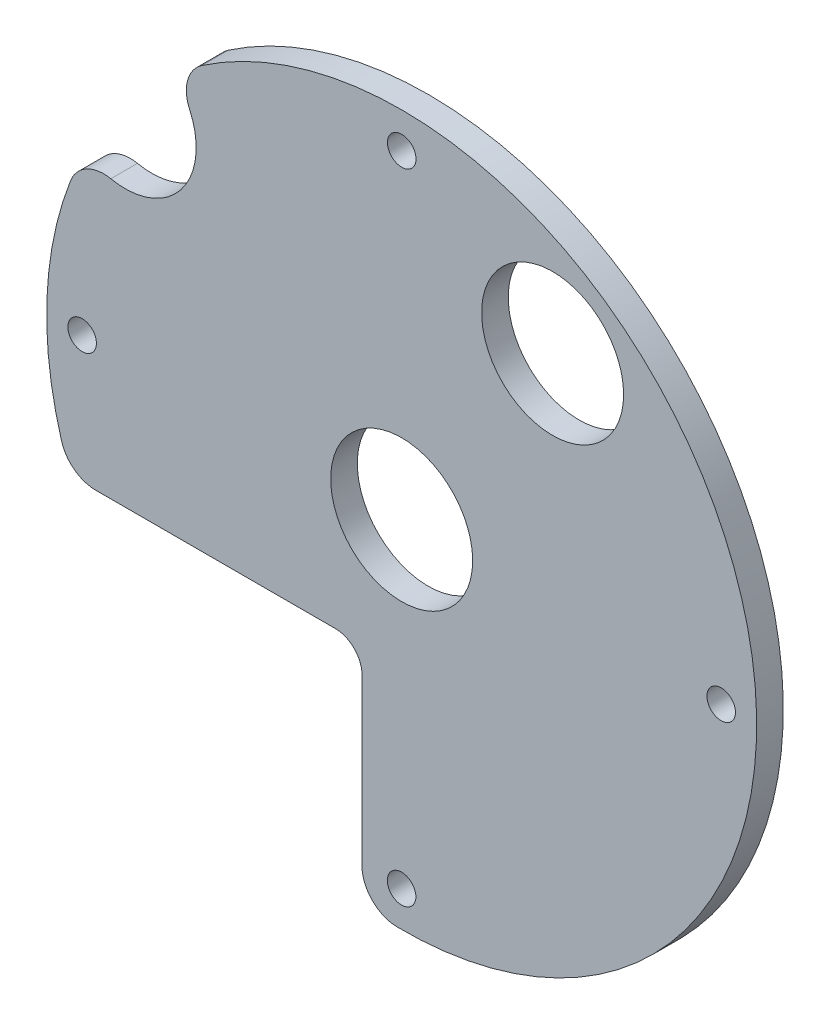
ISO-10303-21;
HEADER;
FILE_DESCRIPTION(('STEP AP214'),'2;1');
FILE_NAME('part.step','',(''),(''),'','','');
FILE_SCHEMA(('AUTOMOTIVE_DESIGN { 1 0 10303 214 1 1 1 1 }'));
ENDSEC;
DATA;
#1=APPLICATION_CONTEXT('core data for automotive mechanical design processes');
#2=APPLICATION_PROTOCOL_DEFINITION('international standard','automotive_design',2000,#1);
#3=PRODUCT_CONTEXT('',#1,'mechanical');
#4=PRODUCT('Part','Part','',(#3));
#5=PRODUCT_RELATED_PRODUCT_CATEGORY('part','',(#4));
#6=PRODUCT_DEFINITION_FORMATION('','',#4);
#7=PRODUCT_DEFINITION_CONTEXT('part definition',#1,'design');
#8=PRODUCT_DEFINITION('design','',#6,#7);
#9=PRODUCT_DEFINITION_SHAPE('','',#8);
#10=(LENGTH_UNIT() NAMED_UNIT(*) SI_UNIT(.MILLI.,.METRE.));
#11=(NAMED_UNIT(*) PLANE_ANGLE_UNIT() SI_UNIT($,.RADIAN.));
#12=(NAMED_UNIT(*) SI_UNIT($,.STERADIAN.) SOLID_ANGLE_UNIT());
#13=UNCERTAINTY_MEASURE_WITH_UNIT(LENGTH_MEASURE(1.E-05),#10,'distance_accuracy_value','');
#14=(GEOMETRIC_REPRESENTATION_CONTEXT(3) GLOBAL_UNCERTAINTY_ASSIGNED_CONTEXT((#13)) GLOBAL_UNIT_ASSIGNED_CONTEXT((#10,
#11,#12)) REPRESENTATION_CONTEXT('',''));
#15=CARTESIAN_POINT('',(0.,0.,0.));
#16=DIRECTION('',(0.,0.,1.));
#17=DIRECTION('',(1.,0.,0.));
#18=AXIS2_PLACEMENT_3D('',#15,#16,#17);
#19=CARTESIAN_POINT('',(0.,0.,4.7625));
#20=DIRECTION('',(0.,0.,1.));
#21=DIRECTION('',(1.,0.,0.));
#22=AXIS2_PLACEMENT_3D('',#19,#20,#21);
#23=PLANE('',#22);
#24=CARTESIAN_POINT('',(-45.9257174755712,45.9966999999998,4.7625));
#25=DIRECTION('',(0.,0.,1.));
#26=DIRECTION('',(0.,1.,0.));
#27=AXIS2_PLACEMENT_3D('',#24,#25,#26);
#28=CIRCLE('',#27,2.5527);
#29=CARTESIAN_POINT('',(-43.3730174755712,45.9966999999998,4.7625));
#30=VERTEX_POINT('',#29);
#31=EDGE_CURVE('E390',#30,#30,#28,.T.);
#32=ORIENTED_EDGE('',*,*,#31,.F.);
#33=EDGE_LOOP('',(#32));
#34=FACE_BOUND('',#33,.T.);
#35=CARTESIAN_POINT('',(11.2141,-11.1685174755711,4.7625));
#36=DIRECTION('',(0.,0.,1.));
#37=DIRECTION('',(-1.,0.,0.));
#38=AXIS2_PLACEMENT_3D('',#35,#36,#37);
#39=CIRCLE('',#38,2.5527);
#40=CARTESIAN_POINT('',(13.7668,-11.1685174755711,4.7625));
#41=VERTEX_POINT('',#40);
#42=EDGE_CURVE('E396',#41,#41,#39,.T.);
#43=ORIENTED_EDGE('',*,*,#42,.F.);
#44=EDGE_LOOP('',(#43));
#45=FACE_BOUND('',#44,.T.);
#46=CARTESIAN_POINT('',(68.3793174755712,45.9713000000006,4.7625));
#47=DIRECTION('',(0.,0.,1.));
#48=DIRECTION('',(0.,-1.,0.));
#49=AXIS2_PLACEMENT_3D('',#46,#47,#48);
#50=CIRCLE('',#49,2.5527);
#51=CARTESIAN_POINT('',(70.9320174755712,45.9713000000006,4.7625));
#52=VERTEX_POINT('',#51);
#53=EDGE_CURVE('E404',#52,#52,#50,.T.);
#54=ORIENTED_EDGE('',*,*,#53,.F.);
#55=EDGE_LOOP('',(#54));
#56=FACE_BOUND('',#55,.T.);
#57=CARTESIAN_POINT('',(11.2395,103.136517475571,4.7625));
#58=DIRECTION('',(0.,0.,1.));
#59=DIRECTION('',(1.,0.,0.));
#60=AXIS2_PLACEMENT_3D('',#57,#58,#59);
#61=CIRCLE('',#60,2.5527);
#62=CARTESIAN_POINT('',(13.7922,103.136517475571,4.7625));
#63=VERTEX_POINT('',#62);
#64=EDGE_CURVE('E393',#63,#63,#61,.T.);
#65=ORIENTED_EDGE('',*,*,#64,.F.);
#66=EDGE_LOOP('',(#65));
#67=FACE_BOUND('',#66,.T.);
#68=CARTESIAN_POINT('',(11.2268,45.984,4.7625));
#69=DIRECTION('',(0.,0.,1.));
#70=DIRECTION('',(1.,0.,0.));
#71=AXIS2_PLACEMENT_3D('',#68,#69,#70);
#72=CIRCLE('',#71,12.7);
#73=CARTESIAN_POINT('',(23.9268,45.984,4.7625));
#74=VERTEX_POINT('',#73);
#75=EDGE_CURVE('E152',#74,#74,#72,.T.);
#76=ORIENTED_EDGE('',*,*,#75,.F.);
#77=EDGE_LOOP('',(#76));
#78=FACE_BOUND('',#77,.T.);
#79=CARTESIAN_POINT('',(38.227,85.227,4.7625));
#80=DIRECTION('',(0.,0.,1.));
#81=DIRECTION('',(1.,0.,0.));
#82=AXIS2_PLACEMENT_3D('',#79,#80,#81);
#83=CIRCLE('',#82,12.7);
#84=CARTESIAN_POINT('',(50.927,85.227,4.7625));
#85=VERTEX_POINT('',#84);
#86=EDGE_CURVE('E146',#85,#85,#83,.T.);
#87=ORIENTED_EDGE('',*,*,#86,.F.);
#88=EDGE_LOOP('',(#87));
#89=FACE_BOUND('',#88,.T.);
#90=DIRECTION('',(0.,1.,0.));
#91=VECTOR('',#90,1.);
#92=CARTESIAN_POINT('',(4.12750000000001,23.1875,4.7625));
#93=LINE('',#92,#91);
#94=CARTESIAN_POINT('',(4.12750000000001,-11.161087711106,4.7625));
#95=VERTEX_POINT('',#94);
#96=CARTESIAN_POINT('',(4.12750000000001,18.425,4.7625));
#97=VERTEX_POINT('',#96);
#98=EDGE_CURVE('E129',#95,#97,#93,.T.);
#99=ORIENTED_EDGE('',*,*,#98,.F.);
#100=CARTESIAN_POINT('',(10.4775,-11.161087711106,4.7625));
#101=DIRECTION('',(0.,0.,1.));
#102=DIRECTION('',(1.,0.,0.));
#103=AXIS2_PLACEMENT_3D('',#100,#101,#102);
#104=CIRCLE('',#103,6.35);
#105=CARTESIAN_POINT('',(10.3942444444445,-17.5105419012289,4.7625));
#106=VERTEX_POINT('',#105);
#107=EDGE_CURVE('E181',#95,#106,#104,.T.);
#108=ORIENTED_EDGE('',*,*,#107,.T.);
#109=CARTESIAN_POINT('',(11.2268,45.984,4.7625));
#110=DIRECTION('',(0.,0.,1.));
#111=DIRECTION('',(1.,0.,0.));
#112=AXIS2_PLACEMENT_3D('',#109,#110,#111);
#113=CIRCLE('',#112,63.5);
#114=CARTESIAN_POINT('',(-24.5105781606016,98.4729493341804,4.7625));
#115=VERTEX_POINT('',#114);
#116=EDGE_CURVE('E203',#106,#115,#113,.T.);
#117=ORIENTED_EDGE('',*,*,#116,.T.);
#118=CARTESIAN_POINT('',(-20.9368403445414,93.2240544007624,4.7625));
#119=DIRECTION('',(0.,0.,1.));
#120=DIRECTION('',(1.,0.,0.));
#121=AXIS2_PLACEMENT_3D('',#118,#119,#120);
#122=CIRCLE('',#121,6.35);
#123=CARTESIAN_POINT('',(-26.700226896361,90.5583696005083,4.7625));
#124=VERTEX_POINT('',#123);
#125=EDGE_CURVE('E179',#115,#124,#122,.T.);
#126=ORIENTED_EDGE('',*,*,#125,.T.);
#127=CARTESIAN_POINT('',(-38.227,85.227,4.7625));
#128=DIRECTION('',(0.,0.,1.));
#129=DIRECTION('',(1.,0.,0.));
#130=AXIS2_PLACEMENT_3D('',#127,#128,#129);
#131=CIRCLE('',#130,12.7);
#132=CARTESIAN_POINT('',(-40.7996890811807,72.7903094879878,4.7625));
#133=VERTEX_POINT('',#132);
#134=EDGE_CURVE('E140',#133,#124,#131,.T.);
#135=ORIENTED_EDGE('',*,*,#134,.F.);
#136=CARTESIAN_POINT('',(-42.0860336217711,66.5719642319817,4.7625));
#137=DIRECTION('',(0.,0.,1.));
#138=DIRECTION('',(1.,0.,0.));
#139=AXIS2_PLACEMENT_3D('',#136,#137,#138);
#140=CIRCLE('',#139,6.35);
#141=CARTESIAN_POINT('',(-48.0096818019678,68.859515813313,4.7625));
#142=VERTEX_POINT('',#141);
#143=EDGE_CURVE('E177',#133,#142,#140,.T.);
#144=ORIENTED_EDGE('',*,*,#143,.T.);
#145=CARTESIAN_POINT('',(-49.586972986689,27.7101111111111,4.7625));
#146=VERTEX_POINT('',#145);
#147=EDGE_CURVE('E194',#142,#146,#113,.T.);
#148=ORIENTED_EDGE('',*,*,#147,.T.);
#149=CARTESIAN_POINT('',(-43.5055956880201,29.5375,4.7625));
#150=DIRECTION('',(0.,0.,1.));
#151=DIRECTION('',(1.,0.,0.));
#152=AXIS2_PLACEMENT_3D('',#149,#150,#151);
#153=CIRCLE('',#152,6.35);
#154=CARTESIAN_POINT('',(-43.5055956880201,23.1875,4.7625));
#155=VERTEX_POINT('',#154);
#156=EDGE_CURVE('E49',#146,#155,#153,.T.);
#157=ORIENTED_EDGE('',*,*,#156,.T.);
#158=DIRECTION('',(-1.,0.,0.));
#159=VECTOR('',#158,1.);
#160=CARTESIAN_POINT('',(4.12750000000001,23.1875,4.7625));
#161=LINE('',#160,#159);
#162=CARTESIAN_POINT('',(-0.634999999999993,23.1875,4.7625));
#163=VERTEX_POINT('',#162);
#164=EDGE_CURVE('E125',#163,#155,#161,.T.);
#165=ORIENTED_EDGE('',*,*,#164,.F.);
#166=CARTESIAN_POINT('',(-0.634999999999992,18.425,4.7625));
#167=DIRECTION('',(0.,0.,1.));
#168=DIRECTION('',(1.,0.,0.));
#169=AXIS2_PLACEMENT_3D('',#166,#167,#168);
#170=CIRCLE('',#169,4.7625);
#171=EDGE_CURVE('E112',#163,#97,#170,.F.);
#172=ORIENTED_EDGE('',*,*,#171,.T.);
#173=EDGE_LOOP('',(#99,#108,#117,#126,#135,#144,#148,#157,#165,#172));
#174=FACE_BOUND('',#173,.T.);
#175=ADVANCED_FACE('F34',(#34,#45,#56,#67,#78,#89,#174),#23,.T.);
#176=CARTESIAN_POINT('',(0.,0.,0.));
#177=DIRECTION('',(0.,0.,1.));
#178=DIRECTION('',(1.,0.,0.));
#179=AXIS2_PLACEMENT_3D('',#176,#177,#178);
#180=PLANE('',#179);
#181=CARTESIAN_POINT('',(-45.9257174755712,45.9966999999998,0.));
#182=DIRECTION('',(0.,0.,1.));
#183=DIRECTION('',(0.,1.,0.));
#184=AXIS2_PLACEMENT_3D('',#181,#182,#183);
#185=CIRCLE('',#184,2.5527);
#186=CARTESIAN_POINT('',(-43.3730174755712,45.9966999999998,0.));
#187=VERTEX_POINT('',#186);
#188=EDGE_CURVE('E388',#187,#187,#185,.T.);
#189=ORIENTED_EDGE('',*,*,#188,.T.);
#190=EDGE_LOOP('',(#189));
#191=FACE_BOUND('',#190,.T.);
#192=CARTESIAN_POINT('',(11.2141,-11.1685174755711,0.));
#193=DIRECTION('',(0.,0.,1.));
#194=DIRECTION('',(-1.,0.,0.));
#195=AXIS2_PLACEMENT_3D('',#192,#193,#194);
#196=CIRCLE('',#195,2.5527);
#197=CARTESIAN_POINT('',(13.7668,-11.1685174755711,0.));
#198=VERTEX_POINT('',#197);
#199=EDGE_CURVE('E391',#198,#198,#196,.T.);
#200=ORIENTED_EDGE('',*,*,#199,.T.);
#201=EDGE_LOOP('',(#200));
#202=FACE_BOUND('',#201,.T.);
#203=CARTESIAN_POINT('',(68.3793174755712,45.9713000000006,0.));
#204=DIRECTION('',(0.,0.,1.));
#205=DIRECTION('',(0.,-1.,0.));
#206=AXIS2_PLACEMENT_3D('',#203,#204,#205);
#207=CIRCLE('',#206,2.5527);
#208=CARTESIAN_POINT('',(70.9320174755712,45.9713000000006,0.));
#209=VERTEX_POINT('',#208);
#210=EDGE_CURVE('E401',#209,#209,#207,.T.);
#211=ORIENTED_EDGE('',*,*,#210,.T.);
#212=EDGE_LOOP('',(#211));
#213=FACE_BOUND('',#212,.T.);
#214=CARTESIAN_POINT('',(11.2395,103.136517475571,0.));
#215=DIRECTION('',(0.,0.,1.));
#216=DIRECTION('',(1.,0.,0.));
#217=AXIS2_PLACEMENT_3D('',#214,#215,#216);
#218=CIRCLE('',#217,2.5527);
#219=CARTESIAN_POINT('',(13.7922,103.136517475571,0.));
#220=VERTEX_POINT('',#219);
#221=EDGE_CURVE('E207',#220,#220,#218,.T.);
#222=ORIENTED_EDGE('',*,*,#221,.T.);
#223=EDGE_LOOP('',(#222));
#224=FACE_BOUND('',#223,.T.);
#225=CARTESIAN_POINT('',(11.2268,45.984,0.));
#226=DIRECTION('',(0.,0.,1.));
#227=DIRECTION('',(1.,0.,0.));
#228=AXIS2_PLACEMENT_3D('',#225,#226,#227);
#229=CIRCLE('',#228,12.7);
#230=CARTESIAN_POINT('',(23.9268,45.984,0.));
#231=VERTEX_POINT('',#230);
#232=EDGE_CURVE('E155',#231,#231,#229,.T.);
#233=ORIENTED_EDGE('',*,*,#232,.T.);
#234=EDGE_LOOP('',(#233));
#235=FACE_BOUND('',#234,.T.);
#236=CARTESIAN_POINT('',(38.227,85.227,0.));
#237=DIRECTION('',(0.,0.,1.));
#238=DIRECTION('',(1.,0.,0.));
#239=AXIS2_PLACEMENT_3D('',#236,#237,#238);
#240=CIRCLE('',#239,12.7);
#241=CARTESIAN_POINT('',(50.927,85.227,0.));
#242=VERTEX_POINT('',#241);
#243=EDGE_CURVE('E149',#242,#242,#240,.T.);
#244=ORIENTED_EDGE('',*,*,#243,.T.);
#245=EDGE_LOOP('',(#244));
#246=FACE_BOUND('',#245,.T.);
#247=CARTESIAN_POINT('',(11.2268,45.984,0.));
#248=DIRECTION('',(0.,0.,1.));
#249=DIRECTION('',(1.,0.,0.));
#250=AXIS2_PLACEMENT_3D('',#247,#248,#249);
#251=CIRCLE('',#250,63.5);
#252=CARTESIAN_POINT('',(10.3942444444445,-17.5105419012289,0.));
#253=VERTEX_POINT('',#252);
#254=CARTESIAN_POINT('',(-24.5105781606016,98.4729493341804,0.));
#255=VERTEX_POINT('',#254);
#256=EDGE_CURVE('E134',#253,#255,#251,.T.);
#257=ORIENTED_EDGE('',*,*,#256,.F.);
#258=CARTESIAN_POINT('',(10.4775,-11.161087711106,0.));
#259=DIRECTION('',(0.,0.,1.));
#260=DIRECTION('',(1.,0.,0.));
#261=AXIS2_PLACEMENT_3D('',#258,#259,#260);
#262=CIRCLE('',#261,6.35);
#263=CARTESIAN_POINT('',(4.12750000000001,-11.161087711106,0.));
#264=VERTEX_POINT('',#263);
#265=EDGE_CURVE('E172',#253,#264,#262,.F.);
#266=ORIENTED_EDGE('',*,*,#265,.T.);
#267=DIRECTION('',(0.,1.,0.));
#268=VECTOR('',#267,1.);
#269=CARTESIAN_POINT('',(4.12750000000001,23.1875,0.));
#270=LINE('',#269,#268);
#271=CARTESIAN_POINT('',(4.12750000000001,18.425,0.));
#272=VERTEX_POINT('',#271);
#273=EDGE_CURVE('E137',#264,#272,#270,.T.);
#274=ORIENTED_EDGE('',*,*,#273,.T.);
#275=CARTESIAN_POINT('',(-0.634999999999992,18.425,0.));
#276=DIRECTION('',(0.,0.,1.));
#277=DIRECTION('',(1.,0.,0.));
#278=AXIS2_PLACEMENT_3D('',#275,#276,#277);
#279=CIRCLE('',#278,4.7625);
#280=CARTESIAN_POINT('',(-0.634999999999993,23.1875,0.));
#281=VERTEX_POINT('',#280);
#282=EDGE_CURVE('E120',#272,#281,#279,.T.);
#283=ORIENTED_EDGE('',*,*,#282,.T.);
#284=DIRECTION('',(-1.,0.,0.));
#285=VECTOR('',#284,1.);
#286=CARTESIAN_POINT('',(4.12750000000001,23.1875,0.));
#287=LINE('',#286,#285);
#288=CARTESIAN_POINT('',(-43.5055956880201,23.1875,0.));
#289=VERTEX_POINT('',#288);
#290=EDGE_CURVE('E127',#281,#289,#287,.T.);
#291=ORIENTED_EDGE('',*,*,#290,.T.);
#292=CARTESIAN_POINT('',(-43.5055956880201,29.5375,0.));
#293=DIRECTION('',(0.,0.,1.));
#294=DIRECTION('',(1.,0.,0.));
#295=AXIS2_PLACEMENT_3D('',#292,#293,#294);
#296=CIRCLE('',#295,6.35);
#297=CARTESIAN_POINT('',(-49.586972986689,27.7101111111111,0.));
#298=VERTEX_POINT('',#297);
#299=EDGE_CURVE('E166',#289,#298,#296,.F.);
#300=ORIENTED_EDGE('',*,*,#299,.T.);
#301=CARTESIAN_POINT('',(-48.0096818019678,68.859515813313,0.));
#302=VERTEX_POINT('',#301);
#303=EDGE_CURVE('E130',#302,#298,#251,.T.);
#304=ORIENTED_EDGE('',*,*,#303,.F.);
#305=CARTESIAN_POINT('',(-42.0860336217711,66.5719642319817,0.));
#306=DIRECTION('',(0.,0.,1.));
#307=DIRECTION('',(1.,0.,0.));
#308=AXIS2_PLACEMENT_3D('',#305,#306,#307);
#309=CIRCLE('',#308,6.35);
#310=CARTESIAN_POINT('',(-40.7996890811807,72.7903094879878,0.));
#311=VERTEX_POINT('',#310);
#312=EDGE_CURVE('E168',#302,#311,#309,.F.);
#313=ORIENTED_EDGE('',*,*,#312,.T.);
#314=CARTESIAN_POINT('',(-38.227,85.227,0.));
#315=DIRECTION('',(0.,0.,1.));
#316=DIRECTION('',(1.,0.,0.));
#317=AXIS2_PLACEMENT_3D('',#314,#315,#316);
#318=CIRCLE('',#317,12.7);
#319=CARTESIAN_POINT('',(-26.700226896361,90.5583696005083,0.));
#320=VERTEX_POINT('',#319);
#321=EDGE_CURVE('E143',#311,#320,#318,.T.);
#322=ORIENTED_EDGE('',*,*,#321,.T.);
#323=CARTESIAN_POINT('',(-20.9368403445414,93.2240544007624,0.));
#324=DIRECTION('',(0.,0.,1.));
#325=DIRECTION('',(1.,0.,0.));
#326=AXIS2_PLACEMENT_3D('',#323,#324,#325);
#327=CIRCLE('',#326,6.35);
#328=EDGE_CURVE('E170',#320,#255,#327,.F.);
#329=ORIENTED_EDGE('',*,*,#328,.T.);
#330=EDGE_LOOP('',(#257,#266,#274,#283,#291,#300,#304,#313,#322,#329));
#331=FACE_BOUND('',#330,.T.);
#332=ADVANCED_FACE('F199',(#191,#202,#213,#224,#235,#246,#331),#180,.F.);
#333=CARTESIAN_POINT('',(-38.227,85.227,4.7625));
#334=DIRECTION('',(0.,0.,1.));
#335=DIRECTION('',(1.,0.,0.));
#336=AXIS2_PLACEMENT_3D('',#333,#334,#335);
#337=CYLINDRICAL_SURFACE('',#336,12.7);
#338=ORIENTED_EDGE('',*,*,#134,.T.);
#339=DIRECTION('',(0.,0.,1.));
#340=VECTOR('',#339,1.);
#341=CARTESIAN_POINT('',(-26.700226896361,90.5583696005083,4.7625));
#342=LINE('',#341,#340);
#343=EDGE_CURVE('E185',#124,#320,#342,.F.);
#344=ORIENTED_EDGE('',*,*,#343,.T.);
#345=ORIENTED_EDGE('',*,*,#321,.F.);
#346=DIRECTION('',(0.,0.,1.));
#347=VECTOR('',#346,1.);
#348=CARTESIAN_POINT('',(-40.7996890811807,72.7903094879878,4.7625));
#349=LINE('',#348,#347);
#350=EDGE_CURVE('E183',#311,#133,#349,.T.);
#351=ORIENTED_EDGE('',*,*,#350,.T.);
#352=EDGE_LOOP('',(#338,#344,#345,#351));
#353=FACE_BOUND('',#352,.T.);
#354=ADVANCED_FACE('F226',(#353),#337,.F.);
#355=CARTESIAN_POINT('',(4.12750000000001,23.1875,0.));
#356=DIRECTION('',(0.,1.,0.));
#357=DIRECTION('',(-1.,0.,0.));
#358=AXIS2_PLACEMENT_3D('',#355,#356,#357);
#359=PLANE('',#358);
#360=ORIENTED_EDGE('',*,*,#164,.T.);
#361=DIRECTION('',(0.,0.,-1.));
#362=VECTOR('',#361,1.);
#363=CARTESIAN_POINT('',(-43.5055956880201,23.1875,0.));
#364=LINE('',#363,#362);
#365=EDGE_CURVE('E12',#155,#289,#364,.T.);
#366=ORIENTED_EDGE('',*,*,#365,.T.);
#367=ORIENTED_EDGE('',*,*,#290,.F.);
#368=DIRECTION('',(0.,0.,1.));
#369=VECTOR('',#368,1.);
#370=CARTESIAN_POINT('',(-0.634999999999993,23.1875,4.7625));
#371=LINE('',#370,#369);
#372=EDGE_CURVE('E116',#281,#163,#371,.T.);
#373=ORIENTED_EDGE('',*,*,#372,.T.);
#374=EDGE_LOOP('',(#360,#366,#367,#373));
#375=FACE_BOUND('',#374,.T.);
#376=ADVANCED_FACE('F124',(#375),#359,.F.);
#377=CARTESIAN_POINT('',(4.12750000000001,23.1875,0.));
#378=DIRECTION('',(1.,0.,0.));
#379=DIRECTION('',(0.,1.,0.));
#380=AXIS2_PLACEMENT_3D('',#377,#378,#379);
#381=PLANE('',#380);
#382=ORIENTED_EDGE('',*,*,#273,.F.);
#383=DIRECTION('',(0.,0.,-1.));
#384=VECTOR('',#383,1.);
#385=CARTESIAN_POINT('',(4.12750000000001,-11.161087711106,4.7625));
#386=LINE('',#385,#384);
#387=EDGE_CURVE('E174',#264,#95,#386,.F.);
#388=ORIENTED_EDGE('',*,*,#387,.T.);
#389=ORIENTED_EDGE('',*,*,#98,.T.);
#390=DIRECTION('',(0.,0.,1.));
#391=VECTOR('',#390,1.);
#392=CARTESIAN_POINT('',(4.12750000000001,18.425,0.));
#393=LINE('',#392,#391);
#394=EDGE_CURVE('E118',#97,#272,#393,.F.);
#395=ORIENTED_EDGE('',*,*,#394,.T.);
#396=EDGE_LOOP('',(#382,#388,#389,#395));
#397=FACE_BOUND('',#396,.T.);
#398=ADVANCED_FACE('F212',(#397),#381,.F.);
#399=CARTESIAN_POINT('',(11.2268,45.984,4.7625));
#400=DIRECTION('',(0.,0.,1.));
#401=DIRECTION('',(1.,0.,0.));
#402=AXIS2_PLACEMENT_3D('',#399,#400,#401);
#403=CYLINDRICAL_SURFACE('',#402,12.7);
#404=ORIENTED_EDGE('',*,*,#232,.F.);
#405=EDGE_LOOP('',(#404));
#406=FACE_BOUND('',#405,.T.);
#407=ORIENTED_EDGE('',*,*,#75,.T.);
#408=EDGE_LOOP('',(#407));
#409=FACE_BOUND('',#408,.T.);
#410=ADVANCED_FACE('F248',(#406,#409),#403,.F.);
#411=CARTESIAN_POINT('',(38.227,85.227,4.7625));
#412=DIRECTION('',(0.,0.,1.));
#413=DIRECTION('',(1.,0.,0.));
#414=AXIS2_PLACEMENT_3D('',#411,#412,#413);
#415=CYLINDRICAL_SURFACE('',#414,12.7);
#416=ORIENTED_EDGE('',*,*,#243,.F.);
#417=EDGE_LOOP('',(#416));
#418=FACE_BOUND('',#417,.T.);
#419=ORIENTED_EDGE('',*,*,#86,.T.);
#420=EDGE_LOOP('',(#419));
#421=FACE_BOUND('',#420,.T.);
#422=ADVANCED_FACE('F253',(#418,#421),#415,.F.);
#423=CARTESIAN_POINT('',(-0.634999999999992,18.425,0.));
#424=DIRECTION('',(0.,0.,-1.));
#425=DIRECTION('',(-1.,0.,0.));
#426=AXIS2_PLACEMENT_3D('',#423,#424,#425);
#427=CYLINDRICAL_SURFACE('',#426,4.7625);
#428=ORIENTED_EDGE('',*,*,#282,.F.);
#429=ORIENTED_EDGE('',*,*,#394,.F.);
#430=ORIENTED_EDGE('',*,*,#171,.F.);
#431=ORIENTED_EDGE('',*,*,#372,.F.);
#432=EDGE_LOOP('',(#428,#429,#430,#431));
#433=FACE_BOUND('',#432,.T.);
#434=ADVANCED_FACE('F115',(#433),#427,.F.);
#435=CARTESIAN_POINT('',(11.2268,45.984,0.));
#436=DIRECTION('',(0.,0.,1.));
#437=DIRECTION('',(1.,0.,0.));
#438=AXIS2_PLACEMENT_3D('',#435,#436,#437);
#439=CYLINDRICAL_SURFACE('',#438,63.5);
#440=ORIENTED_EDGE('',*,*,#116,.F.);
#441=DIRECTION('',(0.,0.,1.));
#442=VECTOR('',#441,1.);
#443=CARTESIAN_POINT('',(10.3942444444445,-17.5105419012289,0.));
#444=LINE('',#443,#442);
#445=EDGE_CURVE('E163',#106,#253,#444,.F.);
#446=ORIENTED_EDGE('',*,*,#445,.T.);
#447=ORIENTED_EDGE('',*,*,#256,.T.);
#448=DIRECTION('',(0.,0.,1.));
#449=VECTOR('',#448,1.);
#450=CARTESIAN_POINT('',(-24.5105781606016,98.4729493341804,0.));
#451=LINE('',#450,#449);
#452=EDGE_CURVE('E160',#255,#115,#451,.T.);
#453=ORIENTED_EDGE('',*,*,#452,.T.);
#454=EDGE_LOOP('',(#440,#446,#447,#453));
#455=FACE_BOUND('',#454,.T.);
#456=ADVANCED_FACE('F219',(#455),#439,.T.);
#457=ORIENTED_EDGE('',*,*,#147,.F.);
#458=DIRECTION('',(0.,0.,1.));
#459=VECTOR('',#458,1.);
#460=CARTESIAN_POINT('',(-48.0096818019678,68.859515813313,0.));
#461=LINE('',#460,#459);
#462=EDGE_CURVE('E42',#142,#302,#461,.F.);
#463=ORIENTED_EDGE('',*,*,#462,.T.);
#464=ORIENTED_EDGE('',*,*,#303,.T.);
#465=DIRECTION('',(0.,0.,1.));
#466=VECTOR('',#465,1.);
#467=CARTESIAN_POINT('',(-49.586972986689,27.7101111111112,0.));
#468=LINE('',#467,#466);
#469=EDGE_CURVE('E187',#298,#146,#468,.T.);
#470=ORIENTED_EDGE('',*,*,#469,.T.);
#471=EDGE_LOOP('',(#457,#463,#464,#470));
#472=FACE_BOUND('',#471,.T.);
#473=ADVANCED_FACE('F193',(#472),#439,.T.);
#474=CARTESIAN_POINT('',(10.4775,-11.161087711106,0.));
#475=DIRECTION('',(0.,0.,1.));
#476=DIRECTION('',(1.,0.,0.));
#477=AXIS2_PLACEMENT_3D('',#474,#475,#476);
#478=CYLINDRICAL_SURFACE('',#477,6.35);
#479=ORIENTED_EDGE('',*,*,#107,.F.);
#480=ORIENTED_EDGE('',*,*,#387,.F.);
#481=ORIENTED_EDGE('',*,*,#265,.F.);
#482=ORIENTED_EDGE('',*,*,#445,.F.);
#483=EDGE_LOOP('',(#479,#480,#481,#482));
#484=FACE_BOUND('',#483,.T.);
#485=ADVANCED_FACE('F217',(#484),#478,.T.);
#486=CARTESIAN_POINT('',(-20.9368403445414,93.2240544007624,4.7625));
#487=DIRECTION('',(0.,0.,-1.));
#488=DIRECTION('',(-1.,0.,0.));
#489=AXIS2_PLACEMENT_3D('',#486,#487,#488);
#490=CYLINDRICAL_SURFACE('',#489,6.35);
#491=ORIENTED_EDGE('',*,*,#328,.F.);
#492=ORIENTED_EDGE('',*,*,#343,.F.);
#493=ORIENTED_EDGE('',*,*,#125,.F.);
#494=ORIENTED_EDGE('',*,*,#452,.F.);
#495=EDGE_LOOP('',(#491,#492,#493,#494));
#496=FACE_BOUND('',#495,.T.);
#497=ADVANCED_FACE('F224',(#496),#490,.T.);
#498=CARTESIAN_POINT('',(-42.0860336217711,66.5719642319817,4.7625));
#499=DIRECTION('',(0.,0.,1.));
#500=DIRECTION('',(1.,0.,0.));
#501=AXIS2_PLACEMENT_3D('',#498,#499,#500);
#502=CYLINDRICAL_SURFACE('',#501,6.35);
#503=ORIENTED_EDGE('',*,*,#143,.F.);
#504=ORIENTED_EDGE('',*,*,#350,.F.);
#505=ORIENTED_EDGE('',*,*,#312,.F.);
#506=ORIENTED_EDGE('',*,*,#462,.F.);
#507=EDGE_LOOP('',(#503,#504,#505,#506));
#508=FACE_BOUND('',#507,.T.);
#509=ADVANCED_FACE('F228',(#508),#502,.T.);
#510=CARTESIAN_POINT('',(-43.5055956880201,29.5375,0.));
#511=DIRECTION('',(0.,0.,1.));
#512=DIRECTION('',(1.,0.,0.));
#513=AXIS2_PLACEMENT_3D('',#510,#511,#512);
#514=CYLINDRICAL_SURFACE('',#513,6.35);
#515=ORIENTED_EDGE('',*,*,#299,.F.);
#516=ORIENTED_EDGE('',*,*,#365,.F.);
#517=ORIENTED_EDGE('',*,*,#156,.F.);
#518=ORIENTED_EDGE('',*,*,#469,.F.);
#519=EDGE_LOOP('',(#515,#516,#517,#518));
#520=FACE_BOUND('',#519,.T.);
#521=ADVANCED_FACE('F36',(#520),#514,.T.);
#522=CARTESIAN_POINT('',(11.2395,103.136517475571,0.));
#523=DIRECTION('',(0.,0.,1.));
#524=DIRECTION('',(1.,0.,0.));
#525=AXIS2_PLACEMENT_3D('',#522,#523,#524);
#526=CYLINDRICAL_SURFACE('',#525,2.5527);
#527=CARTESIAN_POINT('',(13.7922,103.136517475571,0.));
#528=CARTESIAN_POINT('',(13.7922,103.136517475571,0.049609375));
#529=CARTESIAN_POINT('',(13.7922,103.136517475571,0.09921875));
#530=CARTESIAN_POINT('',(13.7922,103.136517475571,0.1984375));
#531=CARTESIAN_POINT('',(13.7922,103.136517475571,0.248046875));
#532=CARTESIAN_POINT('',(13.7922,103.136517475571,0.347265625));
#533=CARTESIAN_POINT('',(13.7922,103.136517475571,0.396875));
#534=CARTESIAN_POINT('',(13.7922,103.136517475571,0.49609375));
#535=CARTESIAN_POINT('',(13.7922,103.136517475571,0.545703125));
#536=CARTESIAN_POINT('',(13.7922,103.136517475571,0.644921875));
#537=CARTESIAN_POINT('',(13.7922,103.136517475571,0.69453125));
#538=CARTESIAN_POINT('',(13.7922,103.136517475571,0.79375));
#539=CARTESIAN_POINT('',(13.7922,103.136517475571,0.843359375));
#540=CARTESIAN_POINT('',(13.7922,103.136517475571,0.942578125));
#541=CARTESIAN_POINT('',(13.7922,103.136517475571,0.9921875));
#542=CARTESIAN_POINT('',(13.7922,103.136517475571,1.09140625));
#543=CARTESIAN_POINT('',(13.7922,103.136517475571,1.141015625));
#544=CARTESIAN_POINT('',(13.7922,103.136517475571,1.240234375));
#545=CARTESIAN_POINT('',(13.7922,103.136517475571,1.28984375));
#546=CARTESIAN_POINT('',(13.7922,103.136517475571,1.3890625));
#547=CARTESIAN_POINT('',(13.7922,103.136517475571,1.438671875));
#548=CARTESIAN_POINT('',(13.7922,103.136517475571,1.537890625));
#549=CARTESIAN_POINT('',(13.7922,103.136517475571,1.5875));
#550=CARTESIAN_POINT('',(13.7922,103.136517475571,1.68671875));
#551=CARTESIAN_POINT('',(13.7922,103.136517475571,1.736328125));
#552=CARTESIAN_POINT('',(13.7922,103.136517475571,1.835546875));
#553=CARTESIAN_POINT('',(13.7922,103.136517475571,1.88515625));
#554=CARTESIAN_POINT('',(13.7922,103.136517475571,1.984375));
#555=CARTESIAN_POINT('',(13.7922,103.136517475571,2.033984375));
#556=CARTESIAN_POINT('',(13.7922,103.136517475571,2.133203125));
#557=CARTESIAN_POINT('',(13.7922,103.136517475571,2.1828125));
#558=CARTESIAN_POINT('',(13.7922,103.136517475571,2.28203125));
#559=CARTESIAN_POINT('',(13.7922,103.136517475571,2.331640625));
#560=CARTESIAN_POINT('',(13.7922,103.136517475571,2.430859375));
#561=CARTESIAN_POINT('',(13.7922,103.136517475571,2.48046875));
#562=CARTESIAN_POINT('',(13.7922,103.136517475571,2.5796875));
#563=CARTESIAN_POINT('',(13.7922,103.136517475571,2.629296875));
#564=CARTESIAN_POINT('',(13.7922,103.136517475571,2.728515625));
#565=CARTESIAN_POINT('',(13.7922,103.136517475571,2.778125));
#566=CARTESIAN_POINT('',(13.7922,103.136517475571,2.87734375));
#567=CARTESIAN_POINT('',(13.7922,103.136517475571,2.926953125));
#568=CARTESIAN_POINT('',(13.7922,103.136517475571,3.026171875));
#569=CARTESIAN_POINT('',(13.7922,103.136517475571,3.07578125));
#570=CARTESIAN_POINT('',(13.7922,103.136517475571,3.175));
#571=CARTESIAN_POINT('',(13.7922,103.136517475571,3.224609375));
#572=CARTESIAN_POINT('',(13.7922,103.136517475571,3.323828125));
#573=CARTESIAN_POINT('',(13.7922,103.136517475571,3.3734375));
#574=CARTESIAN_POINT('',(13.7922,103.136517475571,3.47265625));
#575=CARTESIAN_POINT('',(13.7922,103.136517475571,3.522265625));
#576=CARTESIAN_POINT('',(13.7922,103.136517475571,3.621484375));
#577=CARTESIAN_POINT('',(13.7922,103.136517475571,3.67109375));
#578=CARTESIAN_POINT('',(13.7922,103.136517475571,3.7703125));
#579=CARTESIAN_POINT('',(13.7922,103.136517475571,3.819921875));
#580=CARTESIAN_POINT('',(13.7922,103.136517475571,3.919140625));
#581=CARTESIAN_POINT('',(13.7922,103.136517475571,3.96875));
#582=CARTESIAN_POINT('',(13.7922,103.136517475571,4.06796875));
#583=CARTESIAN_POINT('',(13.7922,103.136517475571,4.117578125));
#584=CARTESIAN_POINT('',(13.7922,103.136517475571,4.216796875));
#585=CARTESIAN_POINT('',(13.7922,103.136517475571,4.26640625));
#586=CARTESIAN_POINT('',(13.7922,103.136517475571,4.365625));
#587=CARTESIAN_POINT('',(13.7922,103.136517475571,4.415234375));
#588=CARTESIAN_POINT('',(13.7922,103.136517475571,4.514453125));
#589=CARTESIAN_POINT('',(13.7922,103.136517475571,4.5640625));
#590=CARTESIAN_POINT('',(13.7922,103.136517475571,4.66328125));
#591=CARTESIAN_POINT('',(13.7922,103.136517475571,4.712890625));
#592=CARTESIAN_POINT('',(13.7922,103.136517475571,4.7625));
#593=B_SPLINE_CURVE_WITH_KNOTS('',3,(#527,#528,#529,#530,#531,#532,#533,#534,#535,#536,#537,
#538,#539,#540,#541,#542,#543,#544,#545,#546,#547,#548,#549,#550,#551,#552,#553,#554,#555,#556,
#557,#558,#559,#560,#561,#562,#563,#564,#565,#566,#567,#568,#569,#570,#571,#572,#573,#574,#575,
#576,#577,#578,#579,#580,#581,#582,#583,#584,#585,#586,#587,#588,#589,#590,#591,#592),
.UNSPECIFIED.,.F.,.F.,(4,2,2,2,2,2,2,2,2,2,2,2,2,2,2,2,2,2,2,2,2,2,2,2,2,2,2,2,2,2,2,2,4),(0.,
0.148828125,0.29765625,0.446484375,0.5953125,0.744140625,0.89296875,1.041796875,1.190625,
1.339453125,1.48828125,1.637109375,1.7859375,1.934765625,2.08359375,2.232421875,2.38125,
2.530078125,2.67890625,2.827734375,2.9765625,3.125390625,3.27421875,3.423046875,3.571875,
3.720703125,3.86953125,4.018359375,4.1671875,4.316015625,4.46484375,4.613671875,4.7625),.UNSPECIFIED.);
#594=EDGE_CURVE('BSEAM234',#220,#63,#593,.T.);
#595=ORIENTED_EDGE('',*,*,#221,.F.);
#596=ORIENTED_EDGE('',*,*,#64,.T.);
#597=ORIENTED_EDGE('',*,*,#594,.T.);
#598=ORIENTED_EDGE('',*,*,#594,.F.);
#599=EDGE_LOOP('',(#595,#597,#596,#598));
#600=FACE_BOUND('',#599,.T.);
#601=ADVANCED_FACE('F234',(#600),#526,.F.);
#602=CARTESIAN_POINT('',(68.3793174755712,45.9713000000006,0.));
#603=DIRECTION('',(0.,0.,1.));
#604=DIRECTION('',(1.,0.,0.));
#605=AXIS2_PLACEMENT_3D('',#602,#603,#604);
#606=CYLINDRICAL_SURFACE('',#605,2.5527);
#607=CARTESIAN_POINT('',(70.9320174755712,45.9713000000006,0.));
#608=CARTESIAN_POINT('',(70.9320174755712,45.9713000000006,0.049609375));
#609=CARTESIAN_POINT('',(70.9320174755712,45.9713000000006,0.09921875));
#610=CARTESIAN_POINT('',(70.9320174755712,45.9713000000006,0.1984375));
#611=CARTESIAN_POINT('',(70.9320174755712,45.9713000000006,0.248046875));
#612=CARTESIAN_POINT('',(70.9320174755712,45.9713000000006,0.347265625));
#613=CARTESIAN_POINT('',(70.9320174755712,45.9713000000006,0.396875));
#614=CARTESIAN_POINT('',(70.9320174755712,45.9713000000006,0.49609375));
#615=CARTESIAN_POINT('',(70.9320174755712,45.9713000000006,0.545703125));
#616=CARTESIAN_POINT('',(70.9320174755712,45.9713000000006,0.644921875));
#617=CARTESIAN_POINT('',(70.9320174755712,45.9713000000006,0.69453125));
#618=CARTESIAN_POINT('',(70.9320174755712,45.9713000000006,0.79375));
#619=CARTESIAN_POINT('',(70.9320174755712,45.9713000000006,0.843359375));
#620=CARTESIAN_POINT('',(70.9320174755712,45.9713000000006,0.942578125));
#621=CARTESIAN_POINT('',(70.9320174755712,45.9713000000006,0.9921875));
#622=CARTESIAN_POINT('',(70.9320174755712,45.9713000000006,1.09140625));
#623=CARTESIAN_POINT('',(70.9320174755712,45.9713000000006,1.141015625));
#624=CARTESIAN_POINT('',(70.9320174755712,45.9713000000006,1.240234375));
#625=CARTESIAN_POINT('',(70.9320174755712,45.9713000000006,1.28984375));
#626=CARTESIAN_POINT('',(70.9320174755712,45.9713000000006,1.3890625));
#627=CARTESIAN_POINT('',(70.9320174755712,45.9713000000006,1.438671875));
#628=CARTESIAN_POINT('',(70.9320174755712,45.9713000000006,1.537890625));
#629=CARTESIAN_POINT('',(70.9320174755712,45.9713000000006,1.5875));
#630=CARTESIAN_POINT('',(70.9320174755712,45.9713000000006,1.68671875));
#631=CARTESIAN_POINT('',(70.9320174755712,45.9713000000006,1.736328125));
#632=CARTESIAN_POINT('',(70.9320174755712,45.9713000000006,1.835546875));
#633=CARTESIAN_POINT('',(70.9320174755712,45.9713000000006,1.88515625));
#634=CARTESIAN_POINT('',(70.9320174755712,45.9713000000006,1.984375));
#635=CARTESIAN_POINT('',(70.9320174755712,45.9713000000006,2.033984375));
#636=CARTESIAN_POINT('',(70.9320174755712,45.9713000000006,2.133203125));
#637=CARTESIAN_POINT('',(70.9320174755712,45.9713000000006,2.1828125));
#638=CARTESIAN_POINT('',(70.9320174755712,45.9713000000006,2.28203125));
#639=CARTESIAN_POINT('',(70.9320174755712,45.9713000000006,2.331640625));
#640=CARTESIAN_POINT('',(70.9320174755712,45.9713000000006,2.430859375));
#641=CARTESIAN_POINT('',(70.9320174755712,45.9713000000006,2.48046875));
#642=CARTESIAN_POINT('',(70.9320174755712,45.9713000000006,2.5796875));
#643=CARTESIAN_POINT('',(70.9320174755712,45.9713000000006,2.629296875));
#644=CARTESIAN_POINT('',(70.9320174755712,45.9713000000006,2.728515625));
#645=CARTESIAN_POINT('',(70.9320174755712,45.9713000000006,2.778125));
#646=CARTESIAN_POINT('',(70.9320174755712,45.9713000000006,2.87734375));
#647=CARTESIAN_POINT('',(70.9320174755712,45.9713000000006,2.926953125));
#648=CARTESIAN_POINT('',(70.9320174755712,45.9713000000006,3.026171875));
#649=CARTESIAN_POINT('',(70.9320174755712,45.9713000000006,3.07578125));
#650=CARTESIAN_POINT('',(70.9320174755712,45.9713000000006,3.175));
#651=CARTESIAN_POINT('',(70.9320174755712,45.9713000000006,3.224609375));
#652=CARTESIAN_POINT('',(70.9320174755712,45.9713000000006,3.323828125));
#653=CARTESIAN_POINT('',(70.9320174755712,45.9713000000006,3.3734375));
#654=CARTESIAN_POINT('',(70.9320174755712,45.9713000000006,3.47265625));
#655=CARTESIAN_POINT('',(70.9320174755712,45.9713000000006,3.522265625));
#656=CARTESIAN_POINT('',(70.9320174755712,45.9713000000006,3.621484375));
#657=CARTESIAN_POINT('',(70.9320174755712,45.9713000000006,3.67109375));
#658=CARTESIAN_POINT('',(70.9320174755712,45.9713000000006,3.7703125));
#659=CARTESIAN_POINT('',(70.9320174755712,45.9713000000006,3.819921875));
#660=CARTESIAN_POINT('',(70.9320174755712,45.9713000000006,3.919140625));
#661=CARTESIAN_POINT('',(70.9320174755712,45.9713000000006,3.96875));
#662=CARTESIAN_POINT('',(70.9320174755712,45.9713000000006,4.06796875));
#663=CARTESIAN_POINT('',(70.9320174755712,45.9713000000006,4.117578125));
#664=CARTESIAN_POINT('',(70.9320174755712,45.9713000000006,4.216796875));
#665=CARTESIAN_POINT('',(70.9320174755712,45.9713000000006,4.26640625));
#666=CARTESIAN_POINT('',(70.9320174755712,45.9713000000006,4.365625));
#667=CARTESIAN_POINT('',(70.9320174755712,45.9713000000006,4.415234375));
#668=CARTESIAN_POINT('',(70.9320174755712,45.9713000000006,4.514453125));
#669=CARTESIAN_POINT('',(70.9320174755712,45.9713000000006,4.5640625));
#670=CARTESIAN_POINT('',(70.9320174755712,45.9713000000006,4.66328125));
#671=CARTESIAN_POINT('',(70.9320174755712,45.9713000000006,4.712890625));
#672=CARTESIAN_POINT('',(70.9320174755712,45.9713000000006,4.7625));
#673=B_SPLINE_CURVE_WITH_KNOTS('',3,(#607,#608,#609,#610,#611,#612,#613,#614,#615,#616,#617,
#618,#619,#620,#621,#622,#623,#624,#625,#626,#627,#628,#629,#630,#631,#632,#633,#634,#635,#636,
#637,#638,#639,#640,#641,#642,#643,#644,#645,#646,#647,#648,#649,#650,#651,#652,#653,#654,#655,
#656,#657,#658,#659,#660,#661,#662,#663,#664,#665,#666,#667,#668,#669,#670,#671,#672),
.UNSPECIFIED.,.F.,.F.,(4,2,2,2,2,2,2,2,2,2,2,2,2,2,2,2,2,2,2,2,2,2,2,2,2,2,2,2,2,2,2,2,4),(0.,
0.148828125,0.29765625,0.446484375,0.5953125,0.744140625,0.89296875,1.041796875,1.190625,
1.339453125,1.48828125,1.637109375,1.7859375,1.934765625,2.08359375,2.232421875,2.38125,
2.530078125,2.67890625,2.827734375,2.9765625,3.125390625,3.27421875,3.423046875,3.571875,
3.720703125,3.86953125,4.018359375,4.1671875,4.316015625,4.46484375,4.613671875,4.7625),.UNSPECIFIED.);
#674=EDGE_CURVE('BSEAM352',#209,#52,#673,.T.);
#675=ORIENTED_EDGE('',*,*,#210,.F.);
#676=ORIENTED_EDGE('',*,*,#53,.T.);
#677=ORIENTED_EDGE('',*,*,#674,.T.);
#678=ORIENTED_EDGE('',*,*,#674,.F.);
#679=EDGE_LOOP('',(#675,#677,#676,#678));
#680=FACE_BOUND('',#679,.T.);
#681=ADVANCED_FACE('F352',(#680),#606,.F.);
#682=CARTESIAN_POINT('',(11.2141,-11.1685174755711,0.));
#683=DIRECTION('',(0.,0.,1.));
#684=DIRECTION('',(1.,0.,0.));
#685=AXIS2_PLACEMENT_3D('',#682,#683,#684);
#686=CYLINDRICAL_SURFACE('',#685,2.5527);
#687=CARTESIAN_POINT('',(13.7668,-11.1685174755711,0.));
#688=CARTESIAN_POINT('',(13.7668,-11.1685174755711,0.049609375));
#689=CARTESIAN_POINT('',(13.7668,-11.1685174755711,0.09921875));
#690=CARTESIAN_POINT('',(13.7668,-11.1685174755711,0.1984375));
#691=CARTESIAN_POINT('',(13.7668,-11.1685174755711,0.248046875));
#692=CARTESIAN_POINT('',(13.7668,-11.1685174755711,0.347265625));
#693=CARTESIAN_POINT('',(13.7668,-11.1685174755711,0.396875));
#694=CARTESIAN_POINT('',(13.7668,-11.1685174755711,0.49609375));
#695=CARTESIAN_POINT('',(13.7668,-11.1685174755711,0.545703125));
#696=CARTESIAN_POINT('',(13.7668,-11.1685174755711,0.644921875));
#697=CARTESIAN_POINT('',(13.7668,-11.1685174755711,0.69453125));
#698=CARTESIAN_POINT('',(13.7668,-11.1685174755711,0.79375));
#699=CARTESIAN_POINT('',(13.7668,-11.1685174755711,0.843359375));
#700=CARTESIAN_POINT('',(13.7668,-11.1685174755711,0.942578125));
#701=CARTESIAN_POINT('',(13.7668,-11.1685174755711,0.9921875));
#702=CARTESIAN_POINT('',(13.7668,-11.1685174755711,1.09140625));
#703=CARTESIAN_POINT('',(13.7668,-11.1685174755711,1.141015625));
#704=CARTESIAN_POINT('',(13.7668,-11.1685174755711,1.240234375));
#705=CARTESIAN_POINT('',(13.7668,-11.1685174755711,1.28984375));
#706=CARTESIAN_POINT('',(13.7668,-11.1685174755711,1.3890625));
#707=CARTESIAN_POINT('',(13.7668,-11.1685174755711,1.438671875));
#708=CARTESIAN_POINT('',(13.7668,-11.1685174755711,1.537890625));
#709=CARTESIAN_POINT('',(13.7668,-11.1685174755711,1.5875));
#710=CARTESIAN_POINT('',(13.7668,-11.1685174755711,1.68671875));
#711=CARTESIAN_POINT('',(13.7668,-11.1685174755711,1.736328125));
#712=CARTESIAN_POINT('',(13.7668,-11.1685174755711,1.835546875));
#713=CARTESIAN_POINT('',(13.7668,-11.1685174755711,1.88515625));
#714=CARTESIAN_POINT('',(13.7668,-11.1685174755711,1.984375));
#715=CARTESIAN_POINT('',(13.7668,-11.1685174755711,2.033984375));
#716=CARTESIAN_POINT('',(13.7668,-11.1685174755711,2.133203125));
#717=CARTESIAN_POINT('',(13.7668,-11.1685174755711,2.1828125));
#718=CARTESIAN_POINT('',(13.7668,-11.1685174755711,2.28203125));
#719=CARTESIAN_POINT('',(13.7668,-11.1685174755711,2.331640625));
#720=CARTESIAN_POINT('',(13.7668,-11.1685174755711,2.430859375));
#721=CARTESIAN_POINT('',(13.7668,-11.1685174755711,2.48046875));
#722=CARTESIAN_POINT('',(13.7668,-11.1685174755711,2.5796875));
#723=CARTESIAN_POINT('',(13.7668,-11.1685174755711,2.629296875));
#724=CARTESIAN_POINT('',(13.7668,-11.1685174755711,2.728515625));
#725=CARTESIAN_POINT('',(13.7668,-11.1685174755711,2.778125));
#726=CARTESIAN_POINT('',(13.7668,-11.1685174755711,2.87734375));
#727=CARTESIAN_POINT('',(13.7668,-11.1685174755711,2.926953125));
#728=CARTESIAN_POINT('',(13.7668,-11.1685174755711,3.026171875));
#729=CARTESIAN_POINT('',(13.7668,-11.1685174755711,3.07578125));
#730=CARTESIAN_POINT('',(13.7668,-11.1685174755711,3.175));
#731=CARTESIAN_POINT('',(13.7668,-11.1685174755711,3.224609375));
#732=CARTESIAN_POINT('',(13.7668,-11.1685174755711,3.323828125));
#733=CARTESIAN_POINT('',(13.7668,-11.1685174755711,3.3734375));
#734=CARTESIAN_POINT('',(13.7668,-11.1685174755711,3.47265625));
#735=CARTESIAN_POINT('',(13.7668,-11.1685174755711,3.522265625));
#736=CARTESIAN_POINT('',(13.7668,-11.1685174755711,3.621484375));
#737=CARTESIAN_POINT('',(13.7668,-11.1685174755711,3.67109375));
#738=CARTESIAN_POINT('',(13.7668,-11.1685174755711,3.7703125));
#739=CARTESIAN_POINT('',(13.7668,-11.1685174755711,3.819921875));
#740=CARTESIAN_POINT('',(13.7668,-11.1685174755711,3.919140625));
#741=CARTESIAN_POINT('',(13.7668,-11.1685174755711,3.96875));
#742=CARTESIAN_POINT('',(13.7668,-11.1685174755711,4.06796875));
#743=CARTESIAN_POINT('',(13.7668,-11.1685174755711,4.117578125));
#744=CARTESIAN_POINT('',(13.7668,-11.1685174755711,4.216796875));
#745=CARTESIAN_POINT('',(13.7668,-11.1685174755711,4.26640625));
#746=CARTESIAN_POINT('',(13.7668,-11.1685174755711,4.365625));
#747=CARTESIAN_POINT('',(13.7668,-11.1685174755711,4.415234375));
#748=CARTESIAN_POINT('',(13.7668,-11.1685174755711,4.514453125));
#749=CARTESIAN_POINT('',(13.7668,-11.1685174755711,4.5640625));
#750=CARTESIAN_POINT('',(13.7668,-11.1685174755711,4.66328125));
#751=CARTESIAN_POINT('',(13.7668,-11.1685174755711,4.712890625));
#752=CARTESIAN_POINT('',(13.7668,-11.1685174755711,4.7625));
#753=B_SPLINE_CURVE_WITH_KNOTS('',3,(#687,#688,#689,#690,#691,#692,#693,#694,#695,#696,#697,
#698,#699,#700,#701,#702,#703,#704,#705,#706,#707,#708,#709,#710,#711,#712,#713,#714,#715,#716,
#717,#718,#719,#720,#721,#722,#723,#724,#725,#726,#727,#728,#729,#730,#731,#732,#733,#734,#735,
#736,#737,#738,#739,#740,#741,#742,#743,#744,#745,#746,#747,#748,#749,#750,#751,#752),
.UNSPECIFIED.,.F.,.F.,(4,2,2,2,2,2,2,2,2,2,2,2,2,2,2,2,2,2,2,2,2,2,2,2,2,2,2,2,2,2,2,2,4),(0.,
0.148828125,0.29765625,0.446484375,0.5953125,0.744140625,0.89296875,1.041796875,1.190625,
1.339453125,1.48828125,1.637109375,1.7859375,1.934765625,2.08359375,2.232421875,2.38125,
2.530078125,2.67890625,2.827734375,2.9765625,3.125390625,3.27421875,3.423046875,3.571875,
3.720703125,3.86953125,4.018359375,4.1671875,4.316015625,4.46484375,4.613671875,4.7625),.UNSPECIFIED.);
#754=EDGE_CURVE('BSEAM362',#198,#41,#753,.T.);
#755=ORIENTED_EDGE('',*,*,#199,.F.);
#756=ORIENTED_EDGE('',*,*,#42,.T.);
#757=ORIENTED_EDGE('',*,*,#754,.T.);
#758=ORIENTED_EDGE('',*,*,#754,.F.);
#759=EDGE_LOOP('',(#755,#757,#756,#758));
#760=FACE_BOUND('',#759,.T.);
#761=ADVANCED_FACE('F362',(#760),#686,.F.);
#762=CARTESIAN_POINT('',(-45.9257174755712,45.9966999999998,0.));
#763=DIRECTION('',(0.,0.,1.));
#764=DIRECTION('',(1.,0.,0.));
#765=AXIS2_PLACEMENT_3D('',#762,#763,#764);
#766=CYLINDRICAL_SURFACE('',#765,2.5527);
#767=CARTESIAN_POINT('',(-43.3730174755712,45.9966999999998,0.));
#768=CARTESIAN_POINT('',(-43.3730174755712,45.9966999999998,0.049609375));
#769=CARTESIAN_POINT('',(-43.3730174755712,45.9966999999998,0.09921875));
#770=CARTESIAN_POINT('',(-43.3730174755712,45.9966999999998,0.1984375));
#771=CARTESIAN_POINT('',(-43.3730174755712,45.9966999999998,0.248046875));
#772=CARTESIAN_POINT('',(-43.3730174755712,45.9966999999998,0.347265625));
#773=CARTESIAN_POINT('',(-43.3730174755712,45.9966999999998,0.396875));
#774=CARTESIAN_POINT('',(-43.3730174755712,45.9966999999998,0.49609375));
#775=CARTESIAN_POINT('',(-43.3730174755712,45.9966999999998,0.545703125));
#776=CARTESIAN_POINT('',(-43.3730174755712,45.9966999999998,0.644921875));
#777=CARTESIAN_POINT('',(-43.3730174755712,45.9966999999998,0.69453125));
#778=CARTESIAN_POINT('',(-43.3730174755712,45.9966999999998,0.79375));
#779=CARTESIAN_POINT('',(-43.3730174755712,45.9966999999998,0.843359375));
#780=CARTESIAN_POINT('',(-43.3730174755712,45.9966999999998,0.942578125));
#781=CARTESIAN_POINT('',(-43.3730174755712,45.9966999999998,0.9921875));
#782=CARTESIAN_POINT('',(-43.3730174755712,45.9966999999998,1.09140625));
#783=CARTESIAN_POINT('',(-43.3730174755712,45.9966999999998,1.141015625));
#784=CARTESIAN_POINT('',(-43.3730174755712,45.9966999999998,1.240234375));
#785=CARTESIAN_POINT('',(-43.3730174755712,45.9966999999998,1.28984375));
#786=CARTESIAN_POINT('',(-43.3730174755712,45.9966999999998,1.3890625));
#787=CARTESIAN_POINT('',(-43.3730174755712,45.9966999999998,1.438671875));
#788=CARTESIAN_POINT('',(-43.3730174755712,45.9966999999998,1.537890625));
#789=CARTESIAN_POINT('',(-43.3730174755712,45.9966999999998,1.5875));
#790=CARTESIAN_POINT('',(-43.3730174755712,45.9966999999998,1.68671875));
#791=CARTESIAN_POINT('',(-43.3730174755712,45.9966999999998,1.736328125));
#792=CARTESIAN_POINT('',(-43.3730174755712,45.9966999999998,1.835546875));
#793=CARTESIAN_POINT('',(-43.3730174755712,45.9966999999998,1.88515625));
#794=CARTESIAN_POINT('',(-43.3730174755712,45.9966999999998,1.984375));
#795=CARTESIAN_POINT('',(-43.3730174755712,45.9966999999998,2.033984375));
#796=CARTESIAN_POINT('',(-43.3730174755712,45.9966999999998,2.133203125));
#797=CARTESIAN_POINT('',(-43.3730174755712,45.9966999999998,2.1828125));
#798=CARTESIAN_POINT('',(-43.3730174755712,45.9966999999998,2.28203125));
#799=CARTESIAN_POINT('',(-43.3730174755712,45.9966999999998,2.331640625));
#800=CARTESIAN_POINT('',(-43.3730174755712,45.9966999999998,2.430859375));
#801=CARTESIAN_POINT('',(-43.3730174755712,45.9966999999998,2.48046875));
#802=CARTESIAN_POINT('',(-43.3730174755712,45.9966999999998,2.5796875));
#803=CARTESIAN_POINT('',(-43.3730174755712,45.9966999999998,2.629296875));
#804=CARTESIAN_POINT('',(-43.3730174755712,45.9966999999998,2.728515625));
#805=CARTESIAN_POINT('',(-43.3730174755712,45.9966999999998,2.778125));
#806=CARTESIAN_POINT('',(-43.3730174755712,45.9966999999998,2.87734375));
#807=CARTESIAN_POINT('',(-43.3730174755712,45.9966999999998,2.926953125));
#808=CARTESIAN_POINT('',(-43.3730174755712,45.9966999999998,3.026171875));
#809=CARTESIAN_POINT('',(-43.3730174755712,45.9966999999998,3.07578125));
#810=CARTESIAN_POINT('',(-43.3730174755712,45.9966999999998,3.175));
#811=CARTESIAN_POINT('',(-43.3730174755712,45.9966999999998,3.224609375));
#812=CARTESIAN_POINT('',(-43.3730174755712,45.9966999999998,3.323828125));
#813=CARTESIAN_POINT('',(-43.3730174755712,45.9966999999998,3.3734375));
#814=CARTESIAN_POINT('',(-43.3730174755712,45.9966999999998,3.47265625));
#815=CARTESIAN_POINT('',(-43.3730174755712,45.9966999999998,3.522265625));
#816=CARTESIAN_POINT('',(-43.3730174755712,45.9966999999998,3.621484375));
#817=CARTESIAN_POINT('',(-43.3730174755712,45.9966999999998,3.67109375));
#818=CARTESIAN_POINT('',(-43.3730174755712,45.9966999999998,3.7703125));
#819=CARTESIAN_POINT('',(-43.3730174755712,45.9966999999998,3.819921875));
#820=CARTESIAN_POINT('',(-43.3730174755712,45.9966999999998,3.919140625));
#821=CARTESIAN_POINT('',(-43.3730174755712,45.9966999999998,3.96875));
#822=CARTESIAN_POINT('',(-43.3730174755712,45.9966999999998,4.06796875));
#823=CARTESIAN_POINT('',(-43.3730174755712,45.9966999999998,4.117578125));
#824=CARTESIAN_POINT('',(-43.3730174755712,45.9966999999998,4.216796875));
#825=CARTESIAN_POINT('',(-43.3730174755712,45.9966999999998,4.26640625));
#826=CARTESIAN_POINT('',(-43.3730174755712,45.9966999999998,4.365625));
#827=CARTESIAN_POINT('',(-43.3730174755712,45.9966999999998,4.415234375));
#828=CARTESIAN_POINT('',(-43.3730174755712,45.9966999999998,4.514453125));
#829=CARTESIAN_POINT('',(-43.3730174755712,45.9966999999998,4.5640625));
#830=CARTESIAN_POINT('',(-43.3730174755712,45.9966999999998,4.66328125));
#831=CARTESIAN_POINT('',(-43.3730174755712,45.9966999999998,4.712890625));
#832=CARTESIAN_POINT('',(-43.3730174755712,45.9966999999998,4.7625));
#833=B_SPLINE_CURVE_WITH_KNOTS('',3,(#767,#768,#769,#770,#771,#772,#773,#774,#775,#776,#777,
#778,#779,#780,#781,#782,#783,#784,#785,#786,#787,#788,#789,#790,#791,#792,#793,#794,#795,#796,
#797,#798,#799,#800,#801,#802,#803,#804,#805,#806,#807,#808,#809,#810,#811,#812,#813,#814,#815,
#816,#817,#818,#819,#820,#821,#822,#823,#824,#825,#826,#827,#828,#829,#830,#831,#832),
.UNSPECIFIED.,.F.,.F.,(4,2,2,2,2,2,2,2,2,2,2,2,2,2,2,2,2,2,2,2,2,2,2,2,2,2,2,2,2,2,2,2,4),(0.,
0.148828125,0.29765625,0.446484375,0.5953125,0.744140625,0.89296875,1.041796875,1.190625,
1.339453125,1.48828125,1.637109375,1.7859375,1.934765625,2.08359375,2.232421875,2.38125,
2.530078125,2.67890625,2.827734375,2.9765625,3.125390625,3.27421875,3.423046875,3.571875,
3.720703125,3.86953125,4.018359375,4.1671875,4.316015625,4.46484375,4.613671875,4.7625),.UNSPECIFIED.);
#834=EDGE_CURVE('BSEAM368',#187,#30,#833,.T.);
#835=ORIENTED_EDGE('',*,*,#188,.F.);
#836=ORIENTED_EDGE('',*,*,#31,.T.);
#837=ORIENTED_EDGE('',*,*,#834,.T.);
#838=ORIENTED_EDGE('',*,*,#834,.F.);
#839=EDGE_LOOP('',(#835,#837,#836,#838));
#840=FACE_BOUND('',#839,.T.);
#841=ADVANCED_FACE('F368',(#840),#766,.F.);
#842=CLOSED_SHELL('',(#175,#332,#354,#376,#398,#410,#422,#434,#456,#473,#485,#497,#509,#521,
#601,#681,#761,#841));
#843=MANIFOLD_SOLID_BREP('B2',#842);
#844=ADVANCED_BREP_SHAPE_REPRESENTATION('',(#18,#843),#14);
#845=SHAPE_DEFINITION_REPRESENTATION(#9,#844);
ENDSEC;
END-ISO-10303-21;
